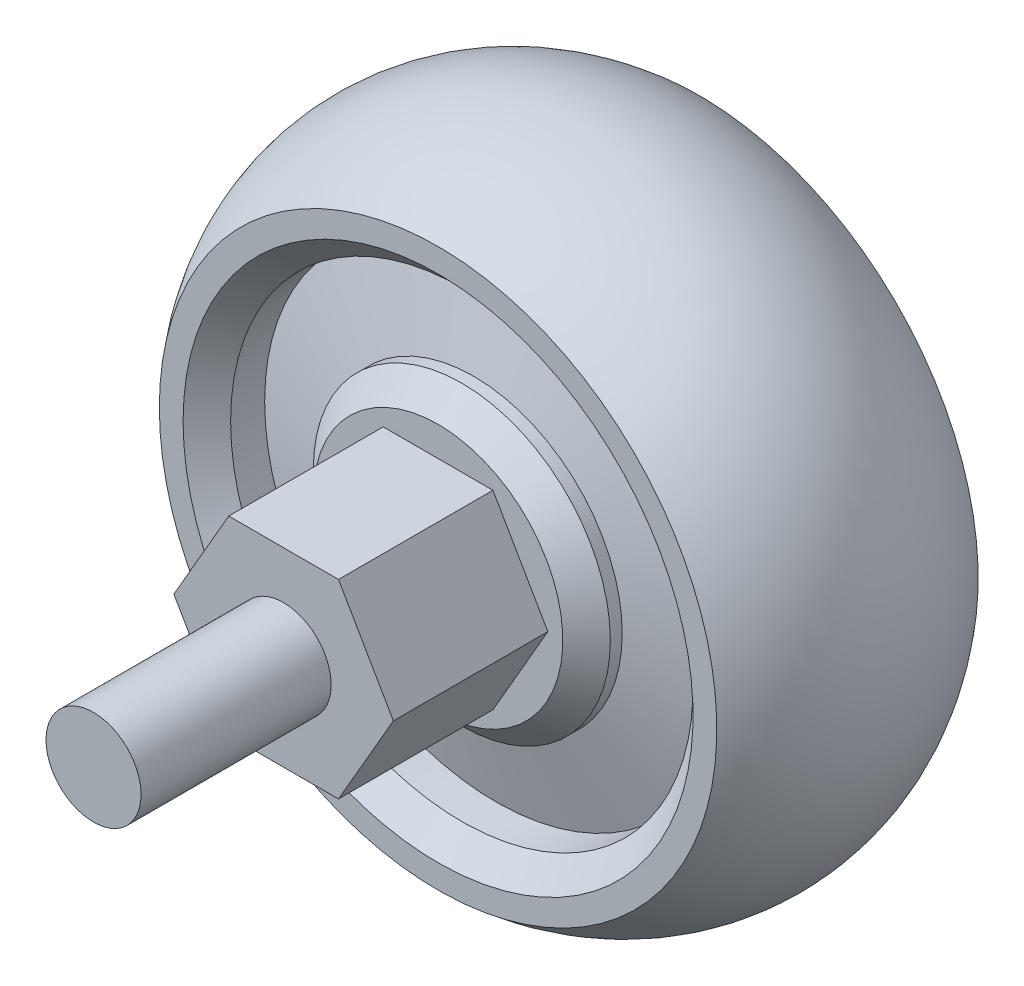
ISO-10303-21;
HEADER;
FILE_DESCRIPTION(('STEP AP214'),'2;1');
FILE_NAME('part.step','',(''),(''),'','','');
FILE_SCHEMA(('AUTOMOTIVE_DESIGN { 1 0 10303 214 1 1 1 1 }'));
ENDSEC;
DATA;
#1=APPLICATION_CONTEXT('core data for automotive mechanical design processes');
#2=APPLICATION_PROTOCOL_DEFINITION('international standard','automotive_design',2000,#1);
#3=PRODUCT_CONTEXT('',#1,'mechanical');
#4=PRODUCT('Part','Part','',(#3));
#5=PRODUCT_RELATED_PRODUCT_CATEGORY('part','',(#4));
#6=PRODUCT_DEFINITION_FORMATION('','',#4);
#7=PRODUCT_DEFINITION_CONTEXT('part definition',#1,'design');
#8=PRODUCT_DEFINITION('design','',#6,#7);
#9=PRODUCT_DEFINITION_SHAPE('','',#8);
#10=(LENGTH_UNIT() NAMED_UNIT(*) SI_UNIT(.MILLI.,.METRE.));
#11=(NAMED_UNIT(*) PLANE_ANGLE_UNIT() SI_UNIT($,.RADIAN.));
#12=(NAMED_UNIT(*) SI_UNIT($,.STERADIAN.) SOLID_ANGLE_UNIT());
#13=UNCERTAINTY_MEASURE_WITH_UNIT(LENGTH_MEASURE(1.E-05),#10,'distance_accuracy_value','');
#14=(GEOMETRIC_REPRESENTATION_CONTEXT(3) GLOBAL_UNCERTAINTY_ASSIGNED_CONTEXT((#13)) GLOBAL_UNIT_ASSIGNED_CONTEXT((#10,
#11,#12)) REPRESENTATION_CONTEXT('',''));
#15=CARTESIAN_POINT('',(0.,0.,0.));
#16=DIRECTION('',(0.,0.,1.));
#17=DIRECTION('',(1.,0.,0.));
#18=AXIS2_PLACEMENT_3D('',#15,#16,#17);
#19=CARTESIAN_POINT('',(0.,0.,7.79103938563071));
#20=DIRECTION('',(0.,0.,-1.));
#21=DIRECTION('',(-1.,0.,0.));
#22=AXIS2_PLACEMENT_3D('',#19,#20,#21);
#23=CONICAL_SURFACE('',#22,24.716081373956,1.30899693899575);
#24=CARTESIAN_POINT('',(0.,0.,10.16));
#25=DIRECTION('',(0.,0.,-1.));
#26=DIRECTION('',(-1.,0.,0.));
#27=AXIS2_PLACEMENT_3D('',#24,#25,#26);
#28=CIRCLE('',#27,15.875);
#29=CARTESIAN_POINT('',(-15.875,0.,10.16));
#30=VERTEX_POINT('',#29);
#31=EDGE_CURVE('E150',#30,#30,#28,.T.);
#32=ORIENTED_EDGE('',*,*,#31,.T.);
#33=EDGE_LOOP('',(#32));
#34=FACE_BOUND('',#33,.T.);
#35=CARTESIAN_POINT('',(0.,0.,7.79103938563071));
#36=DIRECTION('',(0.,0.,-1.));
#37=DIRECTION('',(-1.,0.,0.));
#38=AXIS2_PLACEMENT_3D('',#35,#36,#37);
#39=CIRCLE('',#38,24.716081373956);
#40=CARTESIAN_POINT('',(-24.716081373956,0.,7.79103938563071));
#41=VERTEX_POINT('',#40);
#42=EDGE_CURVE('E153',#41,#41,#39,.T.);
#43=ORIENTED_EDGE('',*,*,#42,.F.);
#44=EDGE_LOOP('',(#43));
#45=FACE_BOUND('',#44,.T.);
#46=ADVANCED_FACE('F38',(#34,#45),#23,.T.);
#47=CARTESIAN_POINT('',(0.,0.,0.));
#48=DIRECTION('',(0.,0.,-1.));
#49=DIRECTION('',(-1.,0.,0.));
#50=AXIS2_PLACEMENT_3D('',#47,#48,#49);
#51=CYLINDRICAL_SURFACE('',#50,15.875);
#52=CARTESIAN_POINT('',(0.,0.,11.43));
#53=DIRECTION('',(0.,0.,-1.));
#54=DIRECTION('',(-1.,0.,0.));
#55=AXIS2_PLACEMENT_3D('',#52,#53,#54);
#56=CIRCLE('',#55,15.875);
#57=CARTESIAN_POINT('',(-15.875,0.,11.43));
#58=VERTEX_POINT('',#57);
#59=EDGE_CURVE('E11',#58,#58,#56,.T.);
#60=ORIENTED_EDGE('',*,*,#59,.T.);
#61=EDGE_LOOP('',(#60));
#62=FACE_BOUND('',#61,.T.);
#63=ORIENTED_EDGE('',*,*,#31,.F.);
#64=EDGE_LOOP('',(#63));
#65=FACE_BOUND('',#64,.T.);
#66=ADVANCED_FACE('F190',(#62,#65),#51,.T.);
#67=CARTESIAN_POINT('',(0.,0.,0.));
#68=DIRECTION('',(0.,0.,-1.));
#69=DIRECTION('',(-1.,0.,0.));
#70=AXIS2_PLACEMENT_3D('',#67,#68,#69);
#71=CYLINDRICAL_SURFACE('',#70,24.716081373956);
#72=CARTESIAN_POINT('',(0.,0.,-11.43));
#73=DIRECTION('',(0.,0.,1.));
#74=DIRECTION('',(1.,0.,0.));
#75=AXIS2_PLACEMENT_3D('',#72,#73,#74);
#76=CIRCLE('',#75,24.716081373956);
#77=CARTESIAN_POINT('',(-24.716081373956,0.,-11.43));
#78=VERTEX_POINT('',#77);
#79=EDGE_CURVE('E159',#78,#78,#76,.F.);
#80=ORIENTED_EDGE('',*,*,#79,.T.);
#81=EDGE_LOOP('',(#80));
#82=FACE_BOUND('',#81,.T.);
#83=CARTESIAN_POINT('',(0.,0.,-7.79103938563071));
#84=DIRECTION('',(0.,0.,1.));
#85=DIRECTION('',(1.,0.,0.));
#86=AXIS2_PLACEMENT_3D('',#83,#84,#85);
#87=CIRCLE('',#86,24.716081373956);
#88=CARTESIAN_POINT('',(24.716081373956,0.,-7.79103938563071));
#89=VERTEX_POINT('',#88);
#90=EDGE_CURVE('E141',#89,#89,#87,.F.);
#91=ORIENTED_EDGE('',*,*,#90,.F.);
#92=EDGE_LOOP('',(#91));
#93=FACE_BOUND('',#92,.T.);
#94=ADVANCED_FACE('F196',(#82,#93),#71,.F.);
#95=CARTESIAN_POINT('',(0.,0.,0.));
#96=DIRECTION('',(0.,0.,-1.));
#97=DIRECTION('',(-1.,0.,0.));
#98=AXIS2_PLACEMENT_3D('',#95,#96,#97);
#99=DEGENERATE_TOROIDAL_SURFACE('',#98,13.335,21.59,.T.);
#100=CARTESIAN_POINT('',(0.,0.,-13.97));
#101=DIRECTION('',(0.,0.,-1.));
#102=DIRECTION('',(-1.,0.,0.));
#103=AXIS2_PLACEMENT_3D('',#100,#101,#102);
#104=CIRCLE('',#103,29.796081373956);
#105=CARTESIAN_POINT('',(-29.796081373956,0.,-13.97));
#106=VERTEX_POINT('',#105);
#107=EDGE_CURVE('E120',#106,#106,#104,.T.);
#108=ORIENTED_EDGE('',*,*,#107,.F.);
#109=EDGE_LOOP('',(#108));
#110=FACE_BOUND('',#109,.T.);
#111=CARTESIAN_POINT('',(0.,0.,13.97));
#112=DIRECTION('',(0.,0.,-1.));
#113=DIRECTION('',(-1.,0.,0.));
#114=AXIS2_PLACEMENT_3D('',#111,#112,#113);
#115=CIRCLE('',#114,29.796081373956);
#116=CARTESIAN_POINT('',(-29.796081373956,0.,13.97));
#117=VERTEX_POINT('',#116);
#118=EDGE_CURVE('E138',#117,#117,#115,.T.);
#119=ORIENTED_EDGE('',*,*,#118,.T.);
#120=EDGE_LOOP('',(#119));
#121=FACE_BOUND('',#120,.T.);
#122=ADVANCED_FACE('F235',(#110,#121),#99,.T.);
#123=CARTESIAN_POINT('',(0.,0.,13.97));
#124=DIRECTION('',(0.,0.,-1.));
#125=DIRECTION('',(-1.,0.,0.));
#126=AXIS2_PLACEMENT_3D('',#123,#124,#125);
#127=PLANE('',#126);
#128=CARTESIAN_POINT('',(0.,0.,13.97));
#129=DIRECTION('',(0.,0.,-1.));
#130=DIRECTION('',(-1.,0.,0.));
#131=AXIS2_PLACEMENT_3D('',#128,#129,#130);
#132=CIRCLE('',#131,27.256081373956);
#133=CARTESIAN_POINT('',(-27.256081373956,0.,13.97));
#134=VERTEX_POINT('',#133);
#135=EDGE_CURVE('E171',#134,#134,#132,.T.);
#136=ORIENTED_EDGE('',*,*,#135,.T.);
#137=EDGE_LOOP('',(#136));
#138=FACE_BOUND('',#137,.T.);
#139=ORIENTED_EDGE('',*,*,#118,.F.);
#140=EDGE_LOOP('',(#139));
#141=FACE_BOUND('',#140,.T.);
#142=ADVANCED_FACE('F282',(#138,#141),#127,.F.);
#143=CARTESIAN_POINT('',(0.,0.,11.43));
#144=DIRECTION('',(0.,0.,-1.));
#145=DIRECTION('',(-1.,0.,0.));
#146=AXIS2_PLACEMENT_3D('',#143,#144,#145);
#147=CIRCLE('',#146,24.716081373956);
#148=CARTESIAN_POINT('',(-24.716081373956,0.,11.43));
#149=VERTEX_POINT('',#148);
#150=EDGE_CURVE('E174',#149,#149,#147,.F.);
#151=ORIENTED_EDGE('',*,*,#150,.T.);
#152=EDGE_LOOP('',(#151));
#153=FACE_BOUND('',#152,.T.);
#154=ORIENTED_EDGE('',*,*,#42,.T.);
#155=EDGE_LOOP('',(#154));
#156=FACE_BOUND('',#155,.T.);
#157=ADVANCED_FACE('F230',(#153,#156),#71,.F.);
#158=CARTESIAN_POINT('',(0.,0.,-13.97));
#159=DIRECTION('',(0.,0.,1.));
#160=DIRECTION('',(1.,0.,0.));
#161=AXIS2_PLACEMENT_3D('',#158,#159,#160);
#162=PLANE('',#161);
#163=CARTESIAN_POINT('',(0.,0.,-13.97));
#164=DIRECTION('',(0.,0.,1.));
#165=DIRECTION('',(1.,0.,0.));
#166=AXIS2_PLACEMENT_3D('',#163,#164,#165);
#167=CIRCLE('',#166,27.256081373956);
#168=CARTESIAN_POINT('',(-27.256081373956,0.,-13.97));
#169=VERTEX_POINT('',#168);
#170=EDGE_CURVE('E162',#169,#169,#167,.T.);
#171=ORIENTED_EDGE('',*,*,#170,.T.);
#172=EDGE_LOOP('',(#171));
#173=FACE_BOUND('',#172,.T.);
#174=ORIENTED_EDGE('',*,*,#107,.T.);
#175=EDGE_LOOP('',(#174));
#176=FACE_BOUND('',#175,.T.);
#177=ADVANCED_FACE('F225',(#173,#176),#162,.F.);
#178=CARTESIAN_POINT('',(0.,0.,-13.97));
#179=DIRECTION('',(0.,0.,-1.));
#180=DIRECTION('',(-1.,0.,0.));
#181=AXIS2_PLACEMENT_3D('',#178,#179,#180);
#182=PLANE('',#181);
#183=CARTESIAN_POINT('',(0.,0.,-13.97));
#184=DIRECTION('',(0.,0.,-1.));
#185=DIRECTION('',(-1.,0.,0.));
#186=AXIS2_PLACEMENT_3D('',#183,#184,#185);
#187=CIRCLE('',#186,13.335);
#188=CARTESIAN_POINT('',(-13.335,0.,-13.97));
#189=VERTEX_POINT('',#188);
#190=EDGE_CURVE('E165',#189,#189,#187,.T.);
#191=ORIENTED_EDGE('',*,*,#190,.T.);
#192=EDGE_LOOP('',(#191));
#193=FACE_BOUND('',#192,.T.);
#194=ADVANCED_FACE('F209',(#193),#182,.T.);
#195=CARTESIAN_POINT('',(0.,0.,0.));
#196=DIRECTION('',(0.,0.,-1.));
#197=DIRECTION('',(-1.,0.,0.));
#198=AXIS2_PLACEMENT_3D('',#195,#196,#197);
#199=CYLINDRICAL_SURFACE('',#198,15.875);
#200=CARTESIAN_POINT('',(0.,0.,-11.43));
#201=DIRECTION('',(0.,0.,-1.));
#202=DIRECTION('',(-1.,0.,0.));
#203=AXIS2_PLACEMENT_3D('',#200,#201,#202);
#204=CIRCLE('',#203,15.875);
#205=CARTESIAN_POINT('',(-15.875,0.,-11.43));
#206=VERTEX_POINT('',#205);
#207=EDGE_CURVE('E168',#206,#206,#204,.F.);
#208=ORIENTED_EDGE('',*,*,#207,.T.);
#209=EDGE_LOOP('',(#208));
#210=FACE_BOUND('',#209,.T.);
#211=CARTESIAN_POINT('',(0.,0.,-10.16));
#212=DIRECTION('',(0.,0.,-1.));
#213=DIRECTION('',(-1.,0.,0.));
#214=AXIS2_PLACEMENT_3D('',#211,#212,#213);
#215=CIRCLE('',#214,15.875);
#216=CARTESIAN_POINT('',(-15.875,0.,-10.16));
#217=VERTEX_POINT('',#216);
#218=EDGE_CURVE('E156',#217,#217,#215,.T.);
#219=ORIENTED_EDGE('',*,*,#218,.T.);
#220=EDGE_LOOP('',(#219));
#221=FACE_BOUND('',#220,.T.);
#222=ADVANCED_FACE('F205',(#210,#221),#199,.T.);
#223=CARTESIAN_POINT('',(0.,0.,-10.16));
#224=DIRECTION('',(0.,0.,1.));
#225=DIRECTION('',(1.,0.,0.));
#226=AXIS2_PLACEMENT_3D('',#223,#224,#225);
#227=CONICAL_SURFACE('',#226,15.875,1.30899693899575);
#228=ORIENTED_EDGE('',*,*,#90,.T.);
#229=EDGE_LOOP('',(#228));
#230=FACE_BOUND('',#229,.T.);
#231=ORIENTED_EDGE('',*,*,#218,.F.);
#232=EDGE_LOOP('',(#231));
#233=FACE_BOUND('',#232,.T.);
#234=ADVANCED_FACE('F202',(#230,#233),#227,.T.);
#235=CARTESIAN_POINT('',(5.8658787349666,10.16,-30.9312806053457));
#236=DIRECTION('',(0.,1.,0.));
#237=DIRECTION('',(0.,0.,1.));
#238=AXIS2_PLACEMENT_3D('',#235,#236,#237);
#239=PLANE('',#238);
#240=DIRECTION('',(-1.,0.,0.));
#241=VECTOR('',#240,1.);
#242=CARTESIAN_POINT('',(5.8658787349666,10.16,13.97));
#243=LINE('',#242,#241);
#244=CARTESIAN_POINT('',(5.8658787349666,10.16,13.97));
#245=VERTEX_POINT('',#244);
#246=CARTESIAN_POINT('',(-5.8658787349666,10.16,13.97));
#247=VERTEX_POINT('',#246);
#248=EDGE_CURVE('E103',#245,#247,#243,.T.);
#249=ORIENTED_EDGE('',*,*,#248,.T.);
#250=DIRECTION('',(0.,0.,1.));
#251=VECTOR('',#250,1.);
#252=CARTESIAN_POINT('',(-5.8658787349666,10.16,-30.9312806053457));
#253=LINE('',#252,#251);
#254=CARTESIAN_POINT('',(-5.8658787349666,10.16,30.48));
#255=VERTEX_POINT('',#254);
#256=EDGE_CURVE('E90',#247,#255,#253,.T.);
#257=ORIENTED_EDGE('',*,*,#256,.T.);
#258=DIRECTION('',(-1.,0.,0.));
#259=VECTOR('',#258,1.);
#260=CARTESIAN_POINT('',(5.8658787349666,10.16,30.48));
#261=LINE('',#260,#259);
#262=CARTESIAN_POINT('',(5.8658787349666,10.16,30.48));
#263=VERTEX_POINT('',#262);
#264=EDGE_CURVE('E114',#263,#255,#261,.T.);
#265=ORIENTED_EDGE('',*,*,#264,.F.);
#266=DIRECTION('',(0.,0.,1.));
#267=VECTOR('',#266,1.);
#268=CARTESIAN_POINT('',(5.8658787349666,10.16,-30.9312806053457));
#269=LINE('',#268,#267);
#270=EDGE_CURVE('E108',#245,#263,#269,.T.);
#271=ORIENTED_EDGE('',*,*,#270,.F.);
#272=EDGE_LOOP('',(#249,#257,#265,#271));
#273=FACE_BOUND('',#272,.T.);
#274=ADVANCED_FACE('F107',(#273),#239,.T.);
#275=CARTESIAN_POINT('',(11.7317574699332,0.,-30.9312806053457));
#276=DIRECTION('',(0.866025403784439,0.5,0.));
#277=DIRECTION('',(-0.5,0.866025403784439,0.));
#278=AXIS2_PLACEMENT_3D('',#275,#276,#277);
#279=PLANE('',#278);
#280=DIRECTION('',(-0.5,0.866025403784439,0.));
#281=VECTOR('',#280,1.);
#282=CARTESIAN_POINT('',(11.7317574699332,0.,13.97));
#283=LINE('',#282,#281);
#284=CARTESIAN_POINT('',(11.7317574699332,0.,13.97));
#285=VERTEX_POINT('',#284);
#286=EDGE_CURVE('E110',#285,#245,#283,.T.);
#287=ORIENTED_EDGE('',*,*,#286,.T.);
#288=ORIENTED_EDGE('',*,*,#270,.T.);
#289=DIRECTION('',(-0.5,0.866025403784439,0.));
#290=VECTOR('',#289,1.);
#291=CARTESIAN_POINT('',(11.7317574699332,0.,30.48));
#292=LINE('',#291,#290);
#293=CARTESIAN_POINT('',(11.7317574699332,0.,30.48));
#294=VERTEX_POINT('',#293);
#295=EDGE_CURVE('E128',#294,#263,#292,.T.);
#296=ORIENTED_EDGE('',*,*,#295,.F.);
#297=DIRECTION('',(0.,0.,1.));
#298=VECTOR('',#297,1.);
#299=CARTESIAN_POINT('',(11.7317574699332,0.,-30.9312806053457));
#300=LINE('',#299,#298);
#301=EDGE_CURVE('E126',#285,#294,#300,.T.);
#302=ORIENTED_EDGE('',*,*,#301,.F.);
#303=EDGE_LOOP('',(#287,#288,#296,#302));
#304=FACE_BOUND('',#303,.T.);
#305=ADVANCED_FACE('F268',(#304),#279,.T.);
#306=CARTESIAN_POINT('',(5.8658787349666,-10.16,-30.9312806053457));
#307=DIRECTION('',(0.866025403784438,-0.5,0.));
#308=DIRECTION('',(0.5,0.866025403784439,0.));
#309=AXIS2_PLACEMENT_3D('',#306,#307,#308);
#310=PLANE('',#309);
#311=DIRECTION('',(0.5,0.866025403784439,0.));
#312=VECTOR('',#311,1.);
#313=CARTESIAN_POINT('',(5.8658787349666,-10.16,13.97));
#314=LINE('',#313,#312);
#315=CARTESIAN_POINT('',(5.8658787349666,-10.16,13.97));
#316=VERTEX_POINT('',#315);
#317=EDGE_CURVE('E117',#316,#285,#314,.T.);
#318=ORIENTED_EDGE('',*,*,#317,.T.);
#319=ORIENTED_EDGE('',*,*,#301,.T.);
#320=DIRECTION('',(0.5,0.866025403784439,0.));
#321=VECTOR('',#320,1.);
#322=CARTESIAN_POINT('',(5.8658787349666,-10.16,30.48));
#323=LINE('',#322,#321);
#324=CARTESIAN_POINT('',(5.8658787349666,-10.16,30.48));
#325=VERTEX_POINT('',#324);
#326=EDGE_CURVE('E131',#325,#294,#323,.T.);
#327=ORIENTED_EDGE('',*,*,#326,.F.);
#328=DIRECTION('',(0.,0.,1.));
#329=VECTOR('',#328,1.);
#330=CARTESIAN_POINT('',(5.8658787349666,-10.16,-30.9312806053457));
#331=LINE('',#330,#329);
#332=EDGE_CURVE('E129',#316,#325,#331,.T.);
#333=ORIENTED_EDGE('',*,*,#332,.F.);
#334=EDGE_LOOP('',(#318,#319,#327,#333));
#335=FACE_BOUND('',#334,.T.);
#336=ADVANCED_FACE('F267',(#335),#310,.T.);
#337=CARTESIAN_POINT('',(-5.8658787349666,-10.16,-30.9312806053457));
#338=DIRECTION('',(0.,-1.,0.));
#339=DIRECTION('',(1.,0.,0.));
#340=AXIS2_PLACEMENT_3D('',#337,#338,#339);
#341=PLANE('',#340);
#342=DIRECTION('',(1.,0.,0.));
#343=VECTOR('',#342,1.);
#344=CARTESIAN_POINT('',(-5.8658787349666,-10.16,13.97));
#345=LINE('',#344,#343);
#346=CARTESIAN_POINT('',(-5.8658787349666,-10.16,13.97));
#347=VERTEX_POINT('',#346);
#348=EDGE_CURVE('E121',#347,#316,#345,.T.);
#349=ORIENTED_EDGE('',*,*,#348,.T.);
#350=ORIENTED_EDGE('',*,*,#332,.T.);
#351=DIRECTION('',(1.,0.,0.));
#352=VECTOR('',#351,1.);
#353=CARTESIAN_POINT('',(-5.8658787349666,-10.16,30.48));
#354=LINE('',#353,#352);
#355=CARTESIAN_POINT('',(-5.8658787349666,-10.16,30.48));
#356=VERTEX_POINT('',#355);
#357=EDGE_CURVE('E134',#356,#325,#354,.T.);
#358=ORIENTED_EDGE('',*,*,#357,.F.);
#359=DIRECTION('',(0.,0.,1.));
#360=VECTOR('',#359,1.);
#361=CARTESIAN_POINT('',(-5.8658787349666,-10.16,-30.9312806053457));
#362=LINE('',#361,#360);
#363=EDGE_CURVE('E132',#347,#356,#362,.T.);
#364=ORIENTED_EDGE('',*,*,#363,.F.);
#365=EDGE_LOOP('',(#349,#350,#358,#364));
#366=FACE_BOUND('',#365,.T.);
#367=ADVANCED_FACE('F264',(#366),#341,.T.);
#368=CARTESIAN_POINT('',(-11.7317574699332,0.,-30.9312806053457));
#369=DIRECTION('',(-0.866025403784439,-0.5,0.));
#370=DIRECTION('',(0.5,-0.866025403784439,0.));
#371=AXIS2_PLACEMENT_3D('',#368,#369,#370);
#372=PLANE('',#371);
#373=DIRECTION('',(0.5,-0.866025403784439,0.));
#374=VECTOR('',#373,1.);
#375=CARTESIAN_POINT('',(-11.7317574699332,0.,13.97));
#376=LINE('',#375,#374);
#377=CARTESIAN_POINT('',(-11.7317574699332,0.,13.97));
#378=VERTEX_POINT('',#377);
#379=EDGE_CURVE('E105',#378,#347,#376,.T.);
#380=ORIENTED_EDGE('',*,*,#379,.T.);
#381=ORIENTED_EDGE('',*,*,#363,.T.);
#382=DIRECTION('',(0.5,-0.866025403784439,0.));
#383=VECTOR('',#382,1.);
#384=CARTESIAN_POINT('',(-11.7317574699332,0.,30.48));
#385=LINE('',#384,#383);
#386=CARTESIAN_POINT('',(-11.7317574699332,0.,30.48));
#387=VERTEX_POINT('',#386);
#388=EDGE_CURVE('E53',#387,#356,#385,.T.);
#389=ORIENTED_EDGE('',*,*,#388,.F.);
#390=DIRECTION('',(0.,0.,1.));
#391=VECTOR('',#390,1.);
#392=CARTESIAN_POINT('',(-11.7317574699332,0.,-30.9312806053457));
#393=LINE('',#392,#391);
#394=EDGE_CURVE('E57',#378,#387,#393,.T.);
#395=ORIENTED_EDGE('',*,*,#394,.F.);
#396=EDGE_LOOP('',(#380,#381,#389,#395));
#397=FACE_BOUND('',#396,.T.);
#398=ADVANCED_FACE('F435',(#397),#372,.T.);
#399=CARTESIAN_POINT('',(-5.8658787349666,10.16,-30.9312806053457));
#400=DIRECTION('',(-0.866025403784439,0.5,0.));
#401=DIRECTION('',(-0.5,-0.866025403784439,0.));
#402=AXIS2_PLACEMENT_3D('',#399,#400,#401);
#403=PLANE('',#402);
#404=DIRECTION('',(-0.5,-0.866025403784439,0.));
#405=VECTOR('',#404,1.);
#406=CARTESIAN_POINT('',(-5.8658787349666,10.16,13.97));
#407=LINE('',#406,#405);
#408=EDGE_CURVE('E93',#247,#378,#407,.T.);
#409=ORIENTED_EDGE('',*,*,#408,.T.);
#410=ORIENTED_EDGE('',*,*,#394,.T.);
#411=DIRECTION('',(-0.5,-0.866025403784439,0.));
#412=VECTOR('',#411,1.);
#413=CARTESIAN_POINT('',(-5.8658787349666,10.16,30.48));
#414=LINE('',#413,#412);
#415=EDGE_CURVE('E95',#255,#387,#414,.T.);
#416=ORIENTED_EDGE('',*,*,#415,.F.);
#417=ORIENTED_EDGE('',*,*,#256,.F.);
#418=EDGE_LOOP('',(#409,#410,#416,#417));
#419=FACE_BOUND('',#418,.T.);
#420=ADVANCED_FACE('F92',(#419),#403,.T.);
#421=CARTESIAN_POINT('',(0.,0.,13.97));
#422=DIRECTION('',(0.,0.,-1.));
#423=DIRECTION('',(-1.,0.,0.));
#424=AXIS2_PLACEMENT_3D('',#421,#422,#423);
#425=PLANE('',#424);
#426=CARTESIAN_POINT('',(0.,0.,13.97));
#427=DIRECTION('',(0.,0.,-1.));
#428=DIRECTION('',(-1.,0.,0.));
#429=AXIS2_PLACEMENT_3D('',#426,#427,#428);
#430=CIRCLE('',#429,13.335);
#431=CARTESIAN_POINT('',(-13.335,0.,13.97));
#432=VERTEX_POINT('',#431);
#433=EDGE_CURVE('E46',#432,#432,#430,.F.);
#434=ORIENTED_EDGE('',*,*,#433,.T.);
#435=EDGE_LOOP('',(#434));
#436=FACE_BOUND('',#435,.T.);
#437=ORIENTED_EDGE('',*,*,#286,.F.);
#438=ORIENTED_EDGE('',*,*,#317,.F.);
#439=ORIENTED_EDGE('',*,*,#348,.F.);
#440=ORIENTED_EDGE('',*,*,#379,.F.);
#441=ORIENTED_EDGE('',*,*,#408,.F.);
#442=ORIENTED_EDGE('',*,*,#248,.F.);
#443=EDGE_LOOP('',(#437,#438,#439,#440,#441,#442));
#444=FACE_BOUND('',#443,.T.);
#445=ADVANCED_FACE('F102',(#436,#444),#425,.F.);
#446=CARTESIAN_POINT('',(0.,0.,50.8));
#447=DIRECTION('',(0.,0.,1.));
#448=DIRECTION('',(1.,0.,0.));
#449=AXIS2_PLACEMENT_3D('',#446,#447,#448);
#450=PLANE('',#449);
#451=CARTESIAN_POINT('',(0.,0.,50.8));
#452=DIRECTION('',(0.,0.,-1.));
#453=DIRECTION('',(-1.,0.,0.));
#454=AXIS2_PLACEMENT_3D('',#451,#452,#453);
#455=CIRCLE('',#454,5.07999999999999);
#456=CARTESIAN_POINT('',(-5.07999999999999,0.,50.8));
#457=VERTEX_POINT('',#456);
#458=EDGE_CURVE('E144',#457,#457,#455,.T.);
#459=ORIENTED_EDGE('',*,*,#458,.F.);
#460=EDGE_LOOP('',(#459));
#461=FACE_BOUND('',#460,.T.);
#462=ADVANCED_FACE('F237',(#461),#450,.T.);
#463=CARTESIAN_POINT('',(0.,0.,0.));
#464=DIRECTION('',(0.,0.,-1.));
#465=DIRECTION('',(-1.,0.,0.));
#466=AXIS2_PLACEMENT_3D('',#463,#464,#465);
#467=CYLINDRICAL_SURFACE('',#466,5.08);
#468=ORIENTED_EDGE('',*,*,#458,.T.);
#469=EDGE_LOOP('',(#468));
#470=FACE_BOUND('',#469,.T.);
#471=CARTESIAN_POINT('',(0.,0.,30.48));
#472=DIRECTION('',(0.,0.,-1.));
#473=DIRECTION('',(-1.,0.,0.));
#474=AXIS2_PLACEMENT_3D('',#471,#472,#473);
#475=CIRCLE('',#474,5.08);
#476=CARTESIAN_POINT('',(-5.08,0.,30.48));
#477=VERTEX_POINT('',#476);
#478=EDGE_CURVE('E147',#477,#477,#475,.T.);
#479=ORIENTED_EDGE('',*,*,#478,.F.);
#480=EDGE_LOOP('',(#479));
#481=FACE_BOUND('',#480,.T.);
#482=ADVANCED_FACE('F240',(#470,#481),#467,.T.);
#483=CARTESIAN_POINT('',(0.,0.,30.48));
#484=DIRECTION('',(0.,0.,1.));
#485=DIRECTION('',(1.,0.,0.));
#486=AXIS2_PLACEMENT_3D('',#483,#484,#485);
#487=PLANE('',#486);
#488=ORIENTED_EDGE('',*,*,#478,.T.);
#489=EDGE_LOOP('',(#488));
#490=FACE_BOUND('',#489,.T.);
#491=ORIENTED_EDGE('',*,*,#295,.T.);
#492=ORIENTED_EDGE('',*,*,#264,.T.);
#493=ORIENTED_EDGE('',*,*,#415,.T.);
#494=ORIENTED_EDGE('',*,*,#388,.T.);
#495=ORIENTED_EDGE('',*,*,#357,.T.);
#496=ORIENTED_EDGE('',*,*,#326,.T.);
#497=EDGE_LOOP('',(#491,#492,#493,#494,#495,#496));
#498=FACE_BOUND('',#497,.T.);
#499=ADVANCED_FACE('F214',(#490,#498),#487,.T.);
#500=CARTESIAN_POINT('',(0.,0.,-11.43));
#501=DIRECTION('',(0.,0.,-1.));
#502=DIRECTION('',(-1.,0.,0.));
#503=AXIS2_PLACEMENT_3D('',#500,#501,#502);
#504=CONICAL_SURFACE('',#503,24.716081373956,0.78539816339745);
#505=CARTESIAN_POINT('',(-27.256081373956,0.,-13.97));
#506=CARTESIAN_POINT('',(-27.2296230406226,0.,-13.9435416666667));
#507=CARTESIAN_POINT('',(-27.2031647072893,0.,-13.9170833333333));
#508=CARTESIAN_POINT('',(-27.1502480406226,0.,-13.8641666666667));
#509=CARTESIAN_POINT('',(-27.1237897072893,0.,-13.8377083333333));
#510=CARTESIAN_POINT('',(-27.0708730406226,0.,-13.7847916666667));
#511=CARTESIAN_POINT('',(-27.0444147072893,0.,-13.7583333333333));
#512=CARTESIAN_POINT('',(-26.9914980406226,0.,-13.7054166666667));
#513=CARTESIAN_POINT('',(-26.9650397072893,0.,-13.6789583333333));
#514=CARTESIAN_POINT('',(-26.9121230406226,0.,-13.6260416666667));
#515=CARTESIAN_POINT('',(-26.8856647072893,0.,-13.5995833333333));
#516=CARTESIAN_POINT('',(-26.8327480406226,0.,-13.5466666666667));
#517=CARTESIAN_POINT('',(-26.8062897072893,0.,-13.5202083333333));
#518=CARTESIAN_POINT('',(-26.7533730406226,0.,-13.4672916666667));
#519=CARTESIAN_POINT('',(-26.7269147072893,0.,-13.4408333333333));
#520=CARTESIAN_POINT('',(-26.6739980406226,0.,-13.3879166666667));
#521=CARTESIAN_POINT('',(-26.6475397072893,0.,-13.3614583333333));
#522=CARTESIAN_POINT('',(-26.5946230406226,0.,-13.3085416666667));
#523=CARTESIAN_POINT('',(-26.5681647072893,0.,-13.2820833333333));
#524=CARTESIAN_POINT('',(-26.5152480406226,0.,-13.2291666666667));
#525=CARTESIAN_POINT('',(-26.4887897072893,0.,-13.2027083333333));
#526=CARTESIAN_POINT('',(-26.4358730406226,0.,-13.1497916666667));
#527=CARTESIAN_POINT('',(-26.4094147072893,0.,-13.1233333333333));
#528=CARTESIAN_POINT('',(-26.3564980406226,0.,-13.0704166666667));
#529=CARTESIAN_POINT('',(-26.3300397072893,0.,-13.0439583333333));
#530=CARTESIAN_POINT('',(-26.2771230406226,0.,-12.9910416666667));
#531=CARTESIAN_POINT('',(-26.2506647072893,0.,-12.9645833333333));
#532=CARTESIAN_POINT('',(-26.1977480406226,0.,-12.9116666666667));
#533=CARTESIAN_POINT('',(-26.1712897072893,0.,-12.8852083333333));
#534=CARTESIAN_POINT('',(-26.1183730406226,0.,-12.8322916666667));
#535=CARTESIAN_POINT('',(-26.0919147072893,0.,-12.8058333333333));
#536=CARTESIAN_POINT('',(-26.0389980406226,0.,-12.7529166666667));
#537=CARTESIAN_POINT('',(-26.0125397072893,0.,-12.7264583333333));
#538=CARTESIAN_POINT('',(-25.9596230406226,0.,-12.6735416666667));
#539=CARTESIAN_POINT('',(-25.9331647072893,0.,-12.6470833333333));
#540=CARTESIAN_POINT('',(-25.8802480406226,0.,-12.5941666666667));
#541=CARTESIAN_POINT('',(-25.8537897072893,0.,-12.5677083333333));
#542=CARTESIAN_POINT('',(-25.8008730406226,0.,-12.5147916666667));
#543=CARTESIAN_POINT('',(-25.7744147072893,0.,-12.4883333333333));
#544=CARTESIAN_POINT('',(-25.7214980406226,0.,-12.4354166666667));
#545=CARTESIAN_POINT('',(-25.6950397072893,0.,-12.4089583333333));
#546=CARTESIAN_POINT('',(-25.6421230406226,0.,-12.3560416666667));
#547=CARTESIAN_POINT('',(-25.6156647072893,0.,-12.3295833333333));
#548=CARTESIAN_POINT('',(-25.5627480406226,0.,-12.2766666666667));
#549=CARTESIAN_POINT('',(-25.5362897072893,0.,-12.2502083333333));
#550=CARTESIAN_POINT('',(-25.4833730406226,0.,-12.1972916666667));
#551=CARTESIAN_POINT('',(-25.4569147072893,0.,-12.1708333333333));
#552=CARTESIAN_POINT('',(-25.4039980406226,0.,-12.1179166666667));
#553=CARTESIAN_POINT('',(-25.3775397072893,0.,-12.0914583333333));
#554=CARTESIAN_POINT('',(-25.3246230406226,0.,-12.0385416666667));
#555=CARTESIAN_POINT('',(-25.2981647072893,0.,-12.0120833333333));
#556=CARTESIAN_POINT('',(-25.2452480406226,0.,-11.9591666666667));
#557=CARTESIAN_POINT('',(-25.2187897072893,0.,-11.9327083333333));
#558=CARTESIAN_POINT('',(-25.1658730406226,0.,-11.8797916666667));
#559=CARTESIAN_POINT('',(-25.1394147072893,0.,-11.8533333333333));
#560=CARTESIAN_POINT('',(-25.0864980406226,0.,-11.8004166666667));
#561=CARTESIAN_POINT('',(-25.0600397072893,0.,-11.7739583333334));
#562=CARTESIAN_POINT('',(-25.0071230406226,0.,-11.7210416666667));
#563=CARTESIAN_POINT('',(-24.9806647072893,0.,-11.6945833333333));
#564=CARTESIAN_POINT('',(-24.9277480406226,0.,-11.6416666666667));
#565=CARTESIAN_POINT('',(-24.9012897072893,0.,-11.6152083333334));
#566=CARTESIAN_POINT('',(-24.8483730406226,0.,-11.5622916666667));
#567=CARTESIAN_POINT('',(-24.8219147072893,0.,-11.5358333333334));
#568=CARTESIAN_POINT('',(-24.7689980406226,0.,-11.4829166666667));
#569=CARTESIAN_POINT('',(-24.7425397072893,0.,-11.4564583333334));
#570=CARTESIAN_POINT('',(-24.716081373956,0.,-11.43));
#571=B_SPLINE_CURVE_WITH_KNOTS('',3,(#505,#506,#507,#508,#509,#510,#511,#512,#513,#514,#515,
#516,#517,#518,#519,#520,#521,#522,#523,#524,#525,#526,#527,#528,#529,#530,#531,#532,#533,#534,
#535,#536,#537,#538,#539,#540,#541,#542,#543,#544,#545,#546,#547,#548,#549,#550,#551,#552,#553,
#554,#555,#556,#557,#558,#559,#560,#561,#562,#563,#564,#565,#566,#567,#568,#569,#570),
.UNSPECIFIED.,.F.,.F.,(4,2,2,2,2,2,2,2,2,2,2,2,2,2,2,2,2,2,2,2,2,2,2,2,2,2,2,2,2,2,2,2,4),(0.,
0.112253201513364,0.224506403026728,0.33675960454009,0.449012806053454,0.561266007566818,
0.673519209080182,0.785772410593546,0.898025612106909,1.01027881362027,1.12253201513364,
1.234785216647,1.34703841816037,1.45929161967373,1.57154482118709,1.68379802270046,
1.79605122421382,1.90830442572719,2.02055762724055,2.13281082875391,2.24506403026728,
2.35731723178064,2.469570433294,2.58182363480737,2.69407683632073,2.8063300378341,
2.91858323934746,3.03083644086082,3.14308964237419,3.25534284388755,3.36759604540092,
3.47984924691428,3.59210244842764),.UNSPECIFIED.);
#572=EDGE_CURVE('BSEAM211',#169,#78,#571,.T.);
#573=ORIENTED_EDGE('',*,*,#170,.F.);
#574=ORIENTED_EDGE('',*,*,#79,.F.);
#575=ORIENTED_EDGE('',*,*,#572,.T.);
#576=ORIENTED_EDGE('',*,*,#572,.F.);
#577=EDGE_LOOP('',(#573,#575,#574,#576));
#578=FACE_BOUND('',#577,.T.);
#579=ADVANCED_FACE('F211',(#578),#504,.F.);
#580=CARTESIAN_POINT('',(0.,0.,-13.97));
#581=DIRECTION('',(0.,0.,1.));
#582=DIRECTION('',(1.,0.,0.));
#583=AXIS2_PLACEMENT_3D('',#580,#581,#582);
#584=CONICAL_SURFACE('',#583,13.335,0.785398163397448);
#585=ORIENTED_EDGE('',*,*,#207,.F.);
#586=EDGE_LOOP('',(#585));
#587=FACE_BOUND('',#586,.T.);
#588=ORIENTED_EDGE('',*,*,#190,.F.);
#589=EDGE_LOOP('',(#588));
#590=FACE_BOUND('',#589,.T.);
#591=ADVANCED_FACE('F186',(#587,#590),#584,.T.);
#592=CARTESIAN_POINT('',(0.,0.,13.97));
#593=DIRECTION('',(0.,0.,1.));
#594=DIRECTION('',(1.,0.,0.));
#595=AXIS2_PLACEMENT_3D('',#592,#593,#594);
#596=CONICAL_SURFACE('',#595,27.256081373956,0.785398163397446);
#597=ORIENTED_EDGE('',*,*,#150,.F.);
#598=EDGE_LOOP('',(#597));
#599=FACE_BOUND('',#598,.T.);
#600=ORIENTED_EDGE('',*,*,#135,.F.);
#601=EDGE_LOOP('',(#600));
#602=FACE_BOUND('',#601,.T.);
#603=ADVANCED_FACE('F181',(#599,#602),#596,.F.);
#604=CARTESIAN_POINT('',(0.,0.,13.97));
#605=DIRECTION('',(0.,0.,-1.));
#606=DIRECTION('',(-1.,0.,0.));
#607=AXIS2_PLACEMENT_3D('',#604,#605,#606);
#608=CONICAL_SURFACE('',#607,13.335,0.785398163397444);
#609=ORIENTED_EDGE('',*,*,#59,.F.);
#610=EDGE_LOOP('',(#609));
#611=FACE_BOUND('',#610,.T.);
#612=ORIENTED_EDGE('',*,*,#433,.F.);
#613=EDGE_LOOP('',(#612));
#614=FACE_BOUND('',#613,.T.);
#615=ADVANCED_FACE('F40',(#611,#614),#608,.T.);
#616=CLOSED_SHELL('',(#46,#66,#94,#122,#142,#157,#177,#194,#222,#234,#274,#305,#336,#367,#398,
#420,#445,#462,#482,#499,#579,#591,#603,#615));
#617=MANIFOLD_SOLID_BREP('B2',#616);
#618=ADVANCED_BREP_SHAPE_REPRESENTATION('',(#18,#617),#14);
#619=SHAPE_DEFINITION_REPRESENTATION(#9,#618);
ENDSEC;
END-ISO-10303-21;
